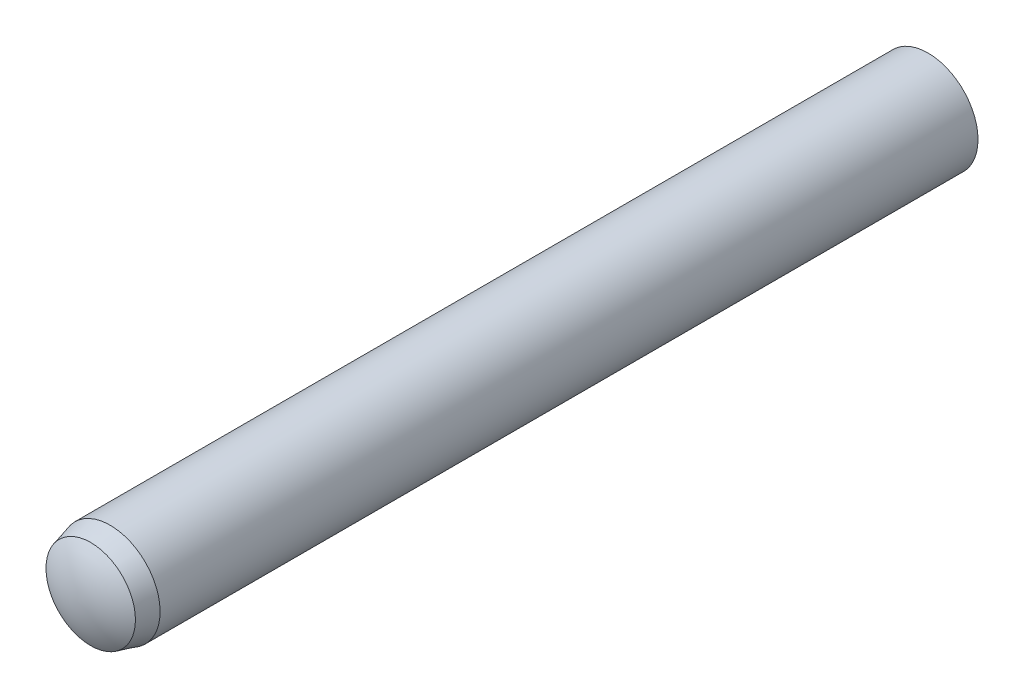
ISO-10303-21;
HEADER;
FILE_DESCRIPTION(('STEP AP214'),'2;1');
FILE_NAME('part.step','',(''),(''),'','','');
FILE_SCHEMA(('AUTOMOTIVE_DESIGN { 1 0 10303 214 1 1 1 1 }'));
ENDSEC;
DATA;
#1=APPLICATION_CONTEXT('core data for automotive mechanical design processes');
#2=APPLICATION_PROTOCOL_DEFINITION('international standard','automotive_design',2000,#1);
#3=PRODUCT_CONTEXT('',#1,'mechanical');
#4=PRODUCT('Part','Part','',(#3));
#5=PRODUCT_RELATED_PRODUCT_CATEGORY('part','',(#4));
#6=PRODUCT_DEFINITION_FORMATION('','',#4);
#7=PRODUCT_DEFINITION_CONTEXT('part definition',#1,'design');
#8=PRODUCT_DEFINITION('design','',#6,#7);
#9=PRODUCT_DEFINITION_SHAPE('','',#8);
#10=(LENGTH_UNIT() NAMED_UNIT(*) SI_UNIT(.MILLI.,.METRE.));
#11=(NAMED_UNIT(*) PLANE_ANGLE_UNIT() SI_UNIT($,.RADIAN.));
#12=(NAMED_UNIT(*) SI_UNIT($,.STERADIAN.) SOLID_ANGLE_UNIT());
#13=UNCERTAINTY_MEASURE_WITH_UNIT(LENGTH_MEASURE(1.E-05),#10,'distance_accuracy_value','');
#14=(GEOMETRIC_REPRESENTATION_CONTEXT(3) GLOBAL_UNCERTAINTY_ASSIGNED_CONTEXT((#13)) GLOBAL_UNIT_ASSIGNED_CONTEXT((#10,
#11,#12)) REPRESENTATION_CONTEXT('',''));
#15=CARTESIAN_POINT('',(0.,0.,0.));
#16=DIRECTION('',(0.,0.,1.));
#17=DIRECTION('',(1.,0.,0.));
#18=AXIS2_PLACEMENT_3D('',#15,#16,#17);
#19=CARTESIAN_POINT('',(0.,0.,-10.275));
#20=DIRECTION('',(0.,0.,1.));
#21=DIRECTION('',(0.,1.,0.));
#22=AXIS2_PLACEMENT_3D('',#19,#20,#21);
#23=SPHERICAL_SURFACE('',#22,2.72500000000001);
#24=CARTESIAN_POINT('',(0.,0.,-12.55));
#25=DIRECTION('',(0.,0.,1.));
#26=DIRECTION('',(0.,-1.,0.));
#27=AXIS2_PLACEMENT_3D('',#24,#25,#26);
#28=CIRCLE('',#27,1.5);
#29=CARTESIAN_POINT('',(0.,-1.49999999999999,-12.55));
#30=VERTEX_POINT('',#29);
#31=EDGE_CURVE('E10',#30,#30,#28,.T.);
#32=ORIENTED_EDGE('',*,*,#31,.F.);
#33=EDGE_LOOP('',(#32));
#34=FACE_BOUND('',#33,.T.);
#35=ADVANCED_FACE('F34',(#34),#23,.T.);
#36=CARTESIAN_POINT('',(0.,0.,13.));
#37=DIRECTION('',(0.,0.,1.));
#38=DIRECTION('',(0.,-1.,0.));
#39=AXIS2_PLACEMENT_3D('',#36,#37,#38);
#40=CYLINDRICAL_SURFACE('',#39,1.5);
#41=CARTESIAN_POINT('',(0.,0.,12.025));
#42=DIRECTION('',(0.,0.,1.));
#43=DIRECTION('',(0.,-1.,0.));
#44=AXIS2_PLACEMENT_3D('',#41,#42,#43);
#45=CIRCLE('',#44,1.5);
#46=CARTESIAN_POINT('',(0.,-1.5,12.025));
#47=VERTEX_POINT('',#46);
#48=EDGE_CURVE('E40',#47,#47,#45,.T.);
#49=ORIENTED_EDGE('',*,*,#48,.F.);
#50=EDGE_LOOP('',(#49));
#51=FACE_BOUND('',#50,.T.);
#52=ORIENTED_EDGE('',*,*,#31,.T.);
#53=EDGE_LOOP('',(#52));
#54=FACE_BOUND('',#53,.T.);
#55=ADVANCED_FACE('F55',(#51,#54),#40,.T.);
#56=CARTESIAN_POINT('',(0.,0.,12.025));
#57=DIRECTION('',(0.,0.,-1.));
#58=DIRECTION('',(0.,1.,0.));
#59=AXIS2_PLACEMENT_3D('',#56,#57,#58);
#60=CONICAL_SURFACE('',#59,1.5,0.261799387799152);
#61=CARTESIAN_POINT('',(0.,0.,12.61));
#62=DIRECTION('',(0.,0.,1.));
#63=DIRECTION('',(0.,-1.,0.));
#64=AXIS2_PLACEMENT_3D('',#61,#62,#63);
#65=CIRCLE('',#64,1.34324972242779);
#66=CARTESIAN_POINT('',(0.,-1.34324972242779,12.61));
#67=VERTEX_POINT('',#66);
#68=EDGE_CURVE('E44',#67,#67,#65,.T.);
#69=ORIENTED_EDGE('',*,*,#68,.F.);
#70=EDGE_LOOP('',(#69));
#71=FACE_BOUND('',#70,.T.);
#72=ORIENTED_EDGE('',*,*,#48,.T.);
#73=EDGE_LOOP('',(#72));
#74=FACE_BOUND('',#73,.T.);
#75=ADVANCED_FACE('F53',(#71,#74),#60,.T.);
#76=CARTESIAN_POINT('',(0.,0.,10.491769465638));
#77=DIRECTION('',(0.,0.,1.));
#78=DIRECTION('',(0.,1.,0.));
#79=AXIS2_PLACEMENT_3D('',#76,#77,#78);
#80=SPHERICAL_SURFACE('',#79,2.50823053436198);
#81=ORIENTED_EDGE('',*,*,#68,.T.);
#82=EDGE_LOOP('',(#81));
#83=FACE_BOUND('',#82,.T.);
#84=ADVANCED_FACE('F51',(#83),#80,.T.);
#85=CLOSED_SHELL('',(#35,#55,#75,#84));
#86=MANIFOLD_SOLID_BREP('B2',#85);
#87=ADVANCED_BREP_SHAPE_REPRESENTATION('',(#18,#86),#14);
#88=SHAPE_DEFINITION_REPRESENTATION(#9,#87);
ENDSEC;
END-ISO-10303-21;
